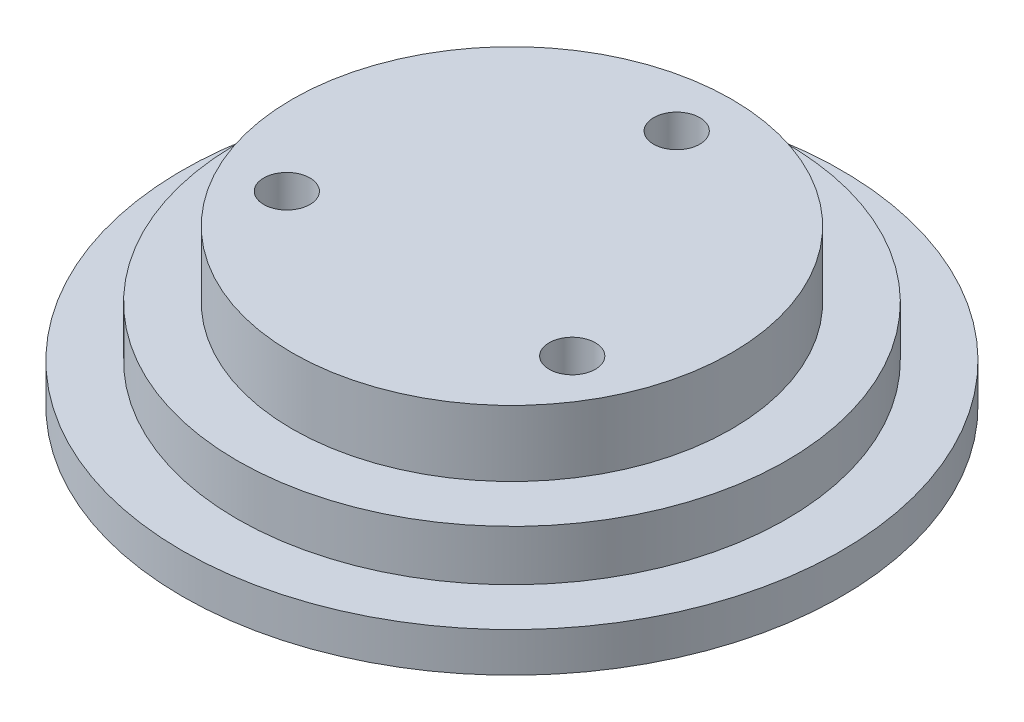
ISO-10303-21;
HEADER;
FILE_DESCRIPTION(('STEP AP214'),'2;1');
FILE_NAME('part.step','',(''),(''),'','','');
FILE_SCHEMA(('AUTOMOTIVE_DESIGN { 1 0 10303 214 1 1 1 1 }'));
ENDSEC;
DATA;
#1=APPLICATION_CONTEXT('core data for automotive mechanical design processes');
#2=APPLICATION_PROTOCOL_DEFINITION('international standard','automotive_design',2000,#1);
#3=PRODUCT_CONTEXT('',#1,'mechanical');
#4=PRODUCT('Part','Part','',(#3));
#5=PRODUCT_RELATED_PRODUCT_CATEGORY('part','',(#4));
#6=PRODUCT_DEFINITION_FORMATION('','',#4);
#7=PRODUCT_DEFINITION_CONTEXT('part definition',#1,'design');
#8=PRODUCT_DEFINITION('design','',#6,#7);
#9=PRODUCT_DEFINITION_SHAPE('','',#8);
#10=(LENGTH_UNIT() NAMED_UNIT(*) SI_UNIT(.MILLI.,.METRE.));
#11=(NAMED_UNIT(*) PLANE_ANGLE_UNIT() SI_UNIT($,.RADIAN.));
#12=(NAMED_UNIT(*) SI_UNIT($,.STERADIAN.) SOLID_ANGLE_UNIT());
#13=UNCERTAINTY_MEASURE_WITH_UNIT(LENGTH_MEASURE(1.E-05),#10,'distance_accuracy_value','');
#14=(GEOMETRIC_REPRESENTATION_CONTEXT(3) GLOBAL_UNCERTAINTY_ASSIGNED_CONTEXT((#13)) GLOBAL_UNIT_ASSIGNED_CONTEXT((#10,
#11,#12)) REPRESENTATION_CONTEXT('',''));
#15=CARTESIAN_POINT('',(0.,0.,0.));
#16=DIRECTION('',(0.,0.,1.));
#17=DIRECTION('',(1.,0.,0.));
#18=AXIS2_PLACEMENT_3D('',#15,#16,#17);
#19=CARTESIAN_POINT('',(0.,3.6,0.));
#20=DIRECTION('',(0.,-1.,0.));
#21=DIRECTION('',(0.,0.,-1.));
#22=AXIS2_PLACEMENT_3D('',#19,#20,#21);
#23=CYLINDRICAL_SURFACE('',#22,30.);
#24=CARTESIAN_POINT('',(0.,3.6,0.));
#25=DIRECTION('',(0.,1.,0.));
#26=DIRECTION('',(0.,0.,1.));
#27=AXIS2_PLACEMENT_3D('',#24,#25,#26);
#28=CIRCLE('',#27,30.);
#29=CARTESIAN_POINT('',(0.,3.6,30.));
#30=VERTEX_POINT('',#29);
#31=EDGE_CURVE('E63',#30,#30,#28,.T.);
#32=ORIENTED_EDGE('',*,*,#31,.F.);
#33=EDGE_LOOP('',(#32));
#34=FACE_BOUND('',#33,.T.);
#35=CARTESIAN_POINT('',(0.,0.,0.));
#36=DIRECTION('',(0.,1.,0.));
#37=DIRECTION('',(0.,0.,1.));
#38=AXIS2_PLACEMENT_3D('',#35,#36,#37);
#39=CIRCLE('',#38,30.);
#40=CARTESIAN_POINT('',(0.,0.,30.));
#41=VERTEX_POINT('',#40);
#42=EDGE_CURVE('E60',#41,#41,#39,.T.);
#43=ORIENTED_EDGE('',*,*,#42,.T.);
#44=EDGE_LOOP('',(#43));
#45=FACE_BOUND('',#44,.T.);
#46=ADVANCED_FACE('F32',(#34,#45),#23,.T.);
#47=CARTESIAN_POINT('',(0.,3.6,0.));
#48=DIRECTION('',(0.,1.,0.));
#49=DIRECTION('',(0.,0.,1.));
#50=AXIS2_PLACEMENT_3D('',#47,#48,#49);
#51=PLANE('',#50);
#52=CARTESIAN_POINT('',(0.,3.6,0.));
#53=DIRECTION('',(0.,1.,0.));
#54=DIRECTION('',(0.,0.,1.));
#55=AXIS2_PLACEMENT_3D('',#52,#53,#54);
#56=CIRCLE('',#55,25.);
#57=CARTESIAN_POINT('',(0.,3.6,25.));
#58=VERTEX_POINT('',#57);
#59=EDGE_CURVE('E67',#58,#58,#56,.T.);
#60=ORIENTED_EDGE('',*,*,#59,.F.);
#61=EDGE_LOOP('',(#60));
#62=FACE_BOUND('',#61,.T.);
#63=ORIENTED_EDGE('',*,*,#31,.T.);
#64=EDGE_LOOP('',(#63));
#65=FACE_BOUND('',#64,.T.);
#66=ADVANCED_FACE('F119',(#62,#65),#51,.T.);
#67=CARTESIAN_POINT('',(0.,0.,0.));
#68=DIRECTION('',(0.,1.,0.));
#69=DIRECTION('',(0.,0.,1.));
#70=AXIS2_PLACEMENT_3D('',#67,#68,#69);
#71=PLANE('',#70);
#72=CARTESIAN_POINT('',(-12.9903810567666,0.,7.49999999999997));
#73=DIRECTION('',(0.,1.,0.));
#74=DIRECTION('',(0.,0.,1.));
#75=AXIS2_PLACEMENT_3D('',#72,#73,#74);
#76=CIRCLE('',#75,4.10000000000001);
#77=CARTESIAN_POINT('',(-12.9903810567666,0.,11.6));
#78=VERTEX_POINT('',#77);
#79=EDGE_CURVE('E44',#78,#78,#76,.T.);
#80=ORIENTED_EDGE('',*,*,#79,.T.);
#81=EDGE_LOOP('',(#80));
#82=FACE_BOUND('',#81,.T.);
#83=CARTESIAN_POINT('',(12.9903810567666,0.,7.49999999999997));
#84=DIRECTION('',(0.,1.,0.));
#85=DIRECTION('',(0.,0.,1.));
#86=AXIS2_PLACEMENT_3D('',#83,#84,#85);
#87=CIRCLE('',#86,4.10000000000001);
#88=CARTESIAN_POINT('',(12.9903810567666,0.,11.6));
#89=VERTEX_POINT('',#88);
#90=EDGE_CURVE('E48',#89,#89,#87,.T.);
#91=ORIENTED_EDGE('',*,*,#90,.T.);
#92=EDGE_LOOP('',(#91));
#93=FACE_BOUND('',#92,.T.);
#94=CARTESIAN_POINT('',(0.,0.,-15.));
#95=DIRECTION('',(0.,1.,0.));
#96=DIRECTION('',(0.,0.,1.));
#97=AXIS2_PLACEMENT_3D('',#94,#95,#96);
#98=CIRCLE('',#97,4.10000000000001);
#99=CARTESIAN_POINT('',(0.,0.,-10.9));
#100=VERTEX_POINT('',#99);
#101=EDGE_CURVE('E53',#100,#100,#98,.T.);
#102=ORIENTED_EDGE('',*,*,#101,.T.);
#103=EDGE_LOOP('',(#102));
#104=FACE_BOUND('',#103,.T.);
#105=ORIENTED_EDGE('',*,*,#42,.F.);
#106=EDGE_LOOP('',(#105));
#107=FACE_BOUND('',#106,.T.);
#108=ADVANCED_FACE('F115',(#82,#93,#104,#107),#71,.F.);
#109=CARTESIAN_POINT('',(0.,8.2,0.));
#110=DIRECTION('',(0.,-1.,0.));
#111=DIRECTION('',(0.,0.,-1.));
#112=AXIS2_PLACEMENT_3D('',#109,#110,#111);
#113=CYLINDRICAL_SURFACE('',#112,25.);
#114=CARTESIAN_POINT('',(0.,8.2,0.));
#115=DIRECTION('',(0.,1.,0.));
#116=DIRECTION('',(0.,0.,1.));
#117=AXIS2_PLACEMENT_3D('',#114,#115,#116);
#118=CIRCLE('',#117,25.);
#119=CARTESIAN_POINT('',(0.,8.2,25.));
#120=VERTEX_POINT('',#119);
#121=EDGE_CURVE('E64',#120,#120,#118,.T.);
#122=ORIENTED_EDGE('',*,*,#121,.F.);
#123=EDGE_LOOP('',(#122));
#124=FACE_BOUND('',#123,.T.);
#125=ORIENTED_EDGE('',*,*,#59,.T.);
#126=EDGE_LOOP('',(#125));
#127=FACE_BOUND('',#126,.T.);
#128=ADVANCED_FACE('F109',(#124,#127),#113,.T.);
#129=CARTESIAN_POINT('',(0.,8.2,0.));
#130=DIRECTION('',(0.,1.,0.));
#131=DIRECTION('',(0.,0.,1.));
#132=AXIS2_PLACEMENT_3D('',#129,#130,#131);
#133=PLANE('',#132);
#134=CARTESIAN_POINT('',(0.,8.2,0.));
#135=DIRECTION('',(0.,1.,0.));
#136=DIRECTION('',(0.,0.,1.));
#137=AXIS2_PLACEMENT_3D('',#134,#135,#136);
#138=CIRCLE('',#137,20.);
#139=CARTESIAN_POINT('',(0.,8.2,20.));
#140=VERTEX_POINT('',#139);
#141=EDGE_CURVE('E59',#140,#140,#138,.T.);
#142=ORIENTED_EDGE('',*,*,#141,.F.);
#143=EDGE_LOOP('',(#142));
#144=FACE_BOUND('',#143,.T.);
#145=ORIENTED_EDGE('',*,*,#121,.T.);
#146=EDGE_LOOP('',(#145));
#147=FACE_BOUND('',#146,.T.);
#148=ADVANCED_FACE('F103',(#144,#147),#133,.T.);
#149=CARTESIAN_POINT('',(0.,14.2,0.));
#150=DIRECTION('',(0.,-1.,0.));
#151=DIRECTION('',(0.,0.,-1.));
#152=AXIS2_PLACEMENT_3D('',#149,#150,#151);
#153=CYLINDRICAL_SURFACE('',#152,20.);
#154=CARTESIAN_POINT('',(0.,14.2,0.));
#155=DIRECTION('',(0.,1.,0.));
#156=DIRECTION('',(0.,0.,1.));
#157=AXIS2_PLACEMENT_3D('',#154,#155,#156);
#158=CIRCLE('',#157,20.);
#159=CARTESIAN_POINT('',(0.,14.2,20.));
#160=VERTEX_POINT('',#159);
#161=EDGE_CURVE('E72',#160,#160,#158,.T.);
#162=ORIENTED_EDGE('',*,*,#161,.F.);
#163=EDGE_LOOP('',(#162));
#164=FACE_BOUND('',#163,.T.);
#165=ORIENTED_EDGE('',*,*,#141,.T.);
#166=EDGE_LOOP('',(#165));
#167=FACE_BOUND('',#166,.T.);
#168=ADVANCED_FACE('F93',(#164,#167),#153,.T.);
#169=CARTESIAN_POINT('',(0.,14.2,0.));
#170=DIRECTION('',(0.,1.,0.));
#171=DIRECTION('',(0.,0.,1.));
#172=AXIS2_PLACEMENT_3D('',#169,#170,#171);
#173=PLANE('',#172);
#174=CARTESIAN_POINT('',(0.,14.2,-15.));
#175=DIRECTION('',(0.,1.,0.));
#176=DIRECTION('',(0.,0.,1.));
#177=AXIS2_PLACEMENT_3D('',#174,#175,#176);
#178=CIRCLE('',#177,2.1);
#179=CARTESIAN_POINT('',(0.,14.2,-12.9));
#180=VERTEX_POINT('',#179);
#181=EDGE_CURVE('E77',#180,#180,#178,.T.);
#182=ORIENTED_EDGE('',*,*,#181,.F.);
#183=EDGE_LOOP('',(#182));
#184=FACE_BOUND('',#183,.T.);
#185=CARTESIAN_POINT('',(12.9903810567666,14.2,7.49999999999997));
#186=DIRECTION('',(0.,1.,0.));
#187=DIRECTION('',(0.,0.,1.));
#188=AXIS2_PLACEMENT_3D('',#185,#186,#187);
#189=CIRCLE('',#188,2.1);
#190=CARTESIAN_POINT('',(12.9903810567666,14.2,9.59999999999996));
#191=VERTEX_POINT('',#190);
#192=EDGE_CURVE('E81',#191,#191,#189,.T.);
#193=ORIENTED_EDGE('',*,*,#192,.F.);
#194=EDGE_LOOP('',(#193));
#195=FACE_BOUND('',#194,.T.);
#196=CARTESIAN_POINT('',(-12.9903810567666,14.2,7.49999999999997));
#197=DIRECTION('',(0.,1.,0.));
#198=DIRECTION('',(0.,0.,1.));
#199=AXIS2_PLACEMENT_3D('',#196,#197,#198);
#200=CIRCLE('',#199,2.1);
#201=CARTESIAN_POINT('',(-12.9903810567666,14.2,9.59999999999997));
#202=VERTEX_POINT('',#201);
#203=EDGE_CURVE('E78',#202,#202,#200,.T.);
#204=ORIENTED_EDGE('',*,*,#203,.F.);
#205=EDGE_LOOP('',(#204));
#206=FACE_BOUND('',#205,.T.);
#207=ORIENTED_EDGE('',*,*,#161,.T.);
#208=EDGE_LOOP('',(#207));
#209=FACE_BOUND('',#208,.T.);
#210=ADVANCED_FACE('F89',(#184,#195,#206,#209),#173,.T.);
#211=CARTESIAN_POINT('',(-12.9903810567666,-0.000999999999999265,7.49999999999997));
#212=DIRECTION('',(0.,1.,0.));
#213=DIRECTION('',(0.,0.,1.));
#214=AXIS2_PLACEMENT_3D('',#211,#212,#213);
#215=CYLINDRICAL_SURFACE('',#214,2.1);
#216=CARTESIAN_POINT('',(-12.9903810567666,2.00000000000001,7.49999999999997));
#217=DIRECTION('',(0.,1.,0.));
#218=DIRECTION('',(0.,0.,1.));
#219=AXIS2_PLACEMENT_3D('',#216,#217,#218);
#220=CIRCLE('',#219,2.1);
#221=CARTESIAN_POINT('',(-12.9903810567666,2.00000000000001,9.59999999999997));
#222=VERTEX_POINT('',#221);
#223=EDGE_CURVE('E56',#222,#222,#220,.F.);
#224=ORIENTED_EDGE('',*,*,#223,.T.);
#225=EDGE_LOOP('',(#224));
#226=FACE_BOUND('',#225,.T.);
#227=ORIENTED_EDGE('',*,*,#203,.T.);
#228=EDGE_LOOP('',(#227));
#229=FACE_BOUND('',#228,.T.);
#230=ADVANCED_FACE('F92',(#226,#229),#215,.F.);
#231=CARTESIAN_POINT('',(12.9903810567666,-0.000999999999999265,7.49999999999997));
#232=DIRECTION('',(0.,1.,0.));
#233=DIRECTION('',(0.,0.,1.));
#234=AXIS2_PLACEMENT_3D('',#231,#232,#233);
#235=CYLINDRICAL_SURFACE('',#234,2.1);
#236=CARTESIAN_POINT('',(12.9903810567666,2.00000000000001,7.49999999999997));
#237=DIRECTION('',(0.,1.,0.));
#238=DIRECTION('',(0.,0.,1.));
#239=AXIS2_PLACEMENT_3D('',#236,#237,#238);
#240=CIRCLE('',#239,2.1);
#241=CARTESIAN_POINT('',(12.9903810567666,2.00000000000001,9.59999999999996));
#242=VERTEX_POINT('',#241);
#243=EDGE_CURVE('E40',#242,#242,#240,.F.);
#244=ORIENTED_EDGE('',*,*,#243,.T.);
#245=EDGE_LOOP('',(#244));
#246=FACE_BOUND('',#245,.T.);
#247=ORIENTED_EDGE('',*,*,#192,.T.);
#248=EDGE_LOOP('',(#247));
#249=FACE_BOUND('',#248,.T.);
#250=ADVANCED_FACE('F179',(#246,#249),#235,.F.);
#251=CARTESIAN_POINT('',(0.,-0.000999999999999265,-15.));
#252=DIRECTION('',(0.,1.,0.));
#253=DIRECTION('',(0.,0.,1.));
#254=AXIS2_PLACEMENT_3D('',#251,#252,#253);
#255=CYLINDRICAL_SURFACE('',#254,2.1);
#256=CARTESIAN_POINT('',(0.,2.00000000000001,-15.));
#257=DIRECTION('',(0.,1.,0.));
#258=DIRECTION('',(0.,0.,1.));
#259=AXIS2_PLACEMENT_3D('',#256,#257,#258);
#260=CIRCLE('',#259,2.1);
#261=CARTESIAN_POINT('',(0.,2.00000000000001,-12.9));
#262=VERTEX_POINT('',#261);
#263=EDGE_CURVE('E10',#262,#262,#260,.F.);
#264=ORIENTED_EDGE('',*,*,#263,.T.);
#265=EDGE_LOOP('',(#264));
#266=FACE_BOUND('',#265,.T.);
#267=ORIENTED_EDGE('',*,*,#181,.T.);
#268=EDGE_LOOP('',(#267));
#269=FACE_BOUND('',#268,.T.);
#270=ADVANCED_FACE('F87',(#266,#269),#255,.F.);
#271=CARTESIAN_POINT('',(-12.9903810567666,2.00000000000001,7.49999999999997));
#272=DIRECTION('',(0.,-1.,0.));
#273=DIRECTION('',(0.,0.,-1.));
#274=AXIS2_PLACEMENT_3D('',#271,#272,#273);
#275=CONICAL_SURFACE('',#274,2.1,0.78539816339745);
#276=ORIENTED_EDGE('',*,*,#79,.F.);
#277=EDGE_LOOP('',(#276));
#278=FACE_BOUND('',#277,.T.);
#279=ORIENTED_EDGE('',*,*,#223,.F.);
#280=EDGE_LOOP('',(#279));
#281=FACE_BOUND('',#280,.T.);
#282=ADVANCED_FACE('F138',(#278,#281),#275,.F.);
#283=CARTESIAN_POINT('',(12.9903810567666,2.00000000000001,7.49999999999997));
#284=DIRECTION('',(0.,-1.,0.));
#285=DIRECTION('',(0.,0.,-1.));
#286=AXIS2_PLACEMENT_3D('',#283,#284,#285);
#287=CONICAL_SURFACE('',#286,2.1,0.78539816339745);
#288=ORIENTED_EDGE('',*,*,#90,.F.);
#289=EDGE_LOOP('',(#288));
#290=FACE_BOUND('',#289,.T.);
#291=ORIENTED_EDGE('',*,*,#243,.F.);
#292=EDGE_LOOP('',(#291));
#293=FACE_BOUND('',#292,.T.);
#294=ADVANCED_FACE('F143',(#290,#293),#287,.F.);
#295=CARTESIAN_POINT('',(0.,2.00000000000001,-15.));
#296=DIRECTION('',(0.,-1.,0.));
#297=DIRECTION('',(0.,0.,-1.));
#298=AXIS2_PLACEMENT_3D('',#295,#296,#297);
#299=CONICAL_SURFACE('',#298,2.1,0.78539816339745);
#300=ORIENTED_EDGE('',*,*,#101,.F.);
#301=EDGE_LOOP('',(#300));
#302=FACE_BOUND('',#301,.T.);
#303=ORIENTED_EDGE('',*,*,#263,.F.);
#304=EDGE_LOOP('',(#303));
#305=FACE_BOUND('',#304,.T.);
#306=ADVANCED_FACE('F35',(#302,#305),#299,.F.);
#307=CLOSED_SHELL('',(#46,#66,#108,#128,#148,#168,#210,#230,#250,#270,#282,#294,#306));
#308=MANIFOLD_SOLID_BREP('B2',#307);
#309=ADVANCED_BREP_SHAPE_REPRESENTATION('',(#18,#308),#14);
#310=SHAPE_DEFINITION_REPRESENTATION(#9,#309);
ENDSEC;
END-ISO-10303-21;
